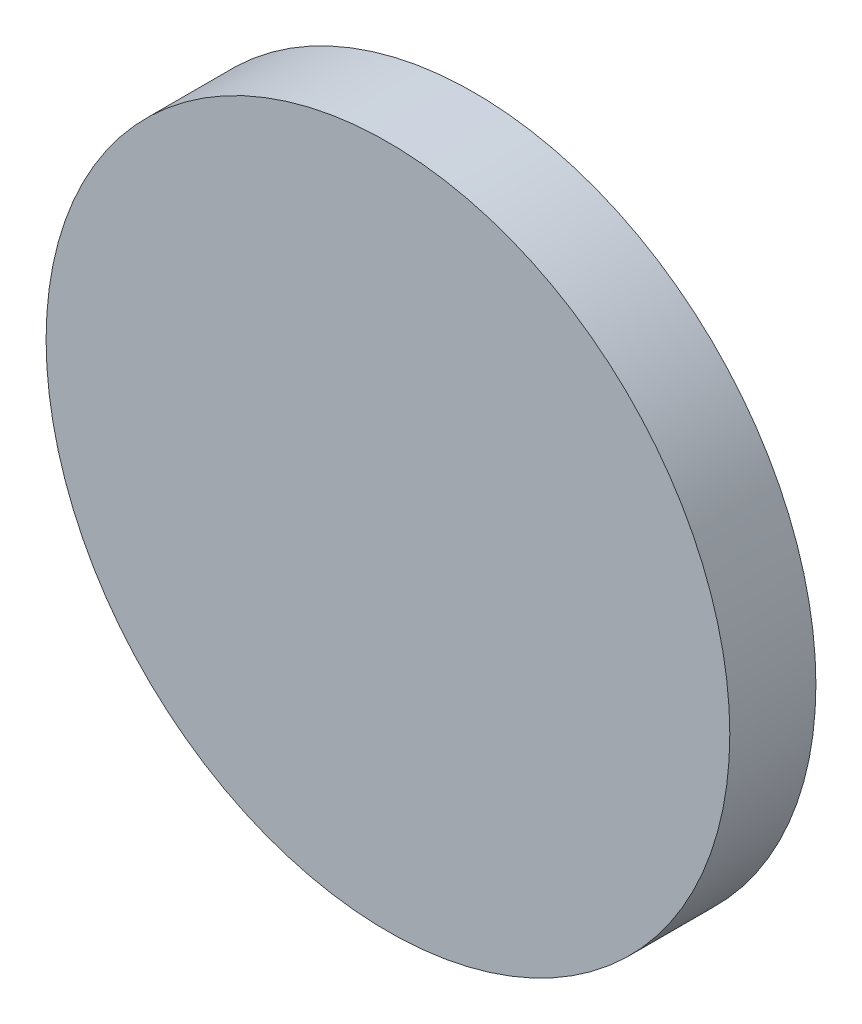
ISO-10303-21;
HEADER;
FILE_DESCRIPTION(('STEP AP214'),'2;1');
FILE_NAME('part.step','',(''),(''),'','','');
FILE_SCHEMA(('AUTOMOTIVE_DESIGN { 1 0 10303 214 1 1 1 1 }'));
ENDSEC;
DATA;
#1=APPLICATION_CONTEXT('core data for automotive mechanical design processes');
#2=APPLICATION_PROTOCOL_DEFINITION('international standard','automotive_design',2000,#1);
#3=PRODUCT_CONTEXT('',#1,'mechanical');
#4=PRODUCT('Part','Part','',(#3));
#5=PRODUCT_RELATED_PRODUCT_CATEGORY('part','',(#4));
#6=PRODUCT_DEFINITION_FORMATION('','',#4);
#7=PRODUCT_DEFINITION_CONTEXT('part definition',#1,'design');
#8=PRODUCT_DEFINITION('design','',#6,#7);
#9=PRODUCT_DEFINITION_SHAPE('','',#8);
#10=(LENGTH_UNIT() NAMED_UNIT(*) SI_UNIT(.MILLI.,.METRE.));
#11=(NAMED_UNIT(*) PLANE_ANGLE_UNIT() SI_UNIT($,.RADIAN.));
#12=(NAMED_UNIT(*) SI_UNIT($,.STERADIAN.) SOLID_ANGLE_UNIT());
#13=UNCERTAINTY_MEASURE_WITH_UNIT(LENGTH_MEASURE(1.E-05),#10,'distance_accuracy_value','');
#14=(GEOMETRIC_REPRESENTATION_CONTEXT(3) GLOBAL_UNCERTAINTY_ASSIGNED_CONTEXT((#13)) GLOBAL_UNIT_ASSIGNED_CONTEXT((#10,
#11,#12)) REPRESENTATION_CONTEXT('',''));
#15=CARTESIAN_POINT('',(0.,0.,0.));
#16=DIRECTION('',(0.,0.,1.));
#17=DIRECTION('',(1.,0.,0.));
#18=AXIS2_PLACEMENT_3D('',#15,#16,#17);
#19=CARTESIAN_POINT('',(0.,0.,3.4));
#20=DIRECTION('',(0.,0.,-1.));
#21=DIRECTION('',(-1.,0.,0.));
#22=AXIS2_PLACEMENT_3D('',#19,#20,#21);
#23=CYLINDRICAL_SURFACE('',#22,13.5);
#24=CARTESIAN_POINT('',(0.,0.,3.4));
#25=DIRECTION('',(0.,0.,1.));
#26=DIRECTION('',(1.,0.,0.));
#27=AXIS2_PLACEMENT_3D('',#24,#25,#26);
#28=CIRCLE('',#27,13.5);
#29=CARTESIAN_POINT('',(13.5,0.,3.4));
#30=VERTEX_POINT('',#29);
#31=EDGE_CURVE('E11',#30,#30,#28,.T.);
#32=ORIENTED_EDGE('',*,*,#31,.F.);
#33=EDGE_LOOP('',(#32));
#34=FACE_BOUND('',#33,.T.);
#35=CARTESIAN_POINT('',(0.,0.,0.));
#36=DIRECTION('',(0.,0.,1.));
#37=DIRECTION('',(1.,0.,0.));
#38=AXIS2_PLACEMENT_3D('',#35,#36,#37);
#39=CIRCLE('',#38,13.5);
#40=CARTESIAN_POINT('',(13.5,0.,0.));
#41=VERTEX_POINT('',#40);
#42=EDGE_CURVE('E36',#41,#41,#39,.T.);
#43=ORIENTED_EDGE('',*,*,#42,.T.);
#44=EDGE_LOOP('',(#43));
#45=FACE_BOUND('',#44,.T.);
#46=ADVANCED_FACE('F33',(#34,#45),#23,.T.);
#47=CARTESIAN_POINT('',(0.,0.,3.4));
#48=DIRECTION('',(0.,0.,1.));
#49=DIRECTION('',(1.,0.,0.));
#50=AXIS2_PLACEMENT_3D('',#47,#48,#49);
#51=PLANE('',#50);
#52=ORIENTED_EDGE('',*,*,#31,.T.);
#53=EDGE_LOOP('',(#52));
#54=FACE_BOUND('',#53,.T.);
#55=ADVANCED_FACE('F58',(#54),#51,.T.);
#56=CARTESIAN_POINT('',(0.,0.,0.));
#57=DIRECTION('',(0.,0.,1.));
#58=DIRECTION('',(1.,0.,0.));
#59=AXIS2_PLACEMENT_3D('',#56,#57,#58);
#60=PLANE('',#59);
#61=CARTESIAN_POINT('',(0.,0.,0.));
#62=DIRECTION('',(0.,0.,-1.));
#63=DIRECTION('',(-1.,0.,0.));
#64=AXIS2_PLACEMENT_3D('',#61,#62,#63);
#65=CIRCLE('',#64,13.);
#66=CARTESIAN_POINT('',(-13.,0.,0.));
#67=VERTEX_POINT('',#66);
#68=EDGE_CURVE('E47',#67,#67,#65,.T.);
#69=ORIENTED_EDGE('',*,*,#68,.F.);
#70=EDGE_LOOP('',(#69));
#71=FACE_BOUND('',#70,.T.);
#72=ORIENTED_EDGE('',*,*,#42,.F.);
#73=EDGE_LOOP('',(#72));
#74=FACE_BOUND('',#73,.T.);
#75=ADVANCED_FACE('F54',(#71,#74),#60,.F.);
#76=CARTESIAN_POINT('',(0.,0.,2.4));
#77=DIRECTION('',(0.,0.,1.));
#78=DIRECTION('',(1.,0.,0.));
#79=AXIS2_PLACEMENT_3D('',#76,#77,#78);
#80=PLANE('',#79);
#81=CARTESIAN_POINT('',(0.,0.,2.4));
#82=DIRECTION('',(0.,0.,1.));
#83=DIRECTION('',(1.,0.,0.));
#84=AXIS2_PLACEMENT_3D('',#81,#82,#83);
#85=CIRCLE('',#84,13.);
#86=CARTESIAN_POINT('',(13.,0.,2.4));
#87=VERTEX_POINT('',#86);
#88=EDGE_CURVE('E43',#87,#87,#85,.F.);
#89=ORIENTED_EDGE('',*,*,#88,.T.);
#90=EDGE_LOOP('',(#89));
#91=FACE_BOUND('',#90,.T.);
#92=ADVANCED_FACE('F57',(#91),#80,.F.);
#93=CARTESIAN_POINT('',(0.,0.,40.1695526217005));
#94=DIRECTION('',(0.,0.,-1.));
#95=DIRECTION('',(-1.,0.,0.));
#96=AXIS2_PLACEMENT_3D('',#93,#94,#95);
#97=CYLINDRICAL_SURFACE('',#96,13.);
#98=ORIENTED_EDGE('',*,*,#68,.T.);
#99=EDGE_LOOP('',(#98));
#100=FACE_BOUND('',#99,.T.);
#101=ORIENTED_EDGE('',*,*,#88,.F.);
#102=EDGE_LOOP('',(#101));
#103=FACE_BOUND('',#102,.T.);
#104=ADVANCED_FACE('F51',(#100,#103),#97,.F.);
#105=CLOSED_SHELL('',(#46,#55,#75,#92,#104));
#106=MANIFOLD_SOLID_BREP('B2',#105);
#107=ADVANCED_BREP_SHAPE_REPRESENTATION('',(#18,#106),#14);
#108=SHAPE_DEFINITION_REPRESENTATION(#9,#107);
ENDSEC;
END-ISO-10303-21;
